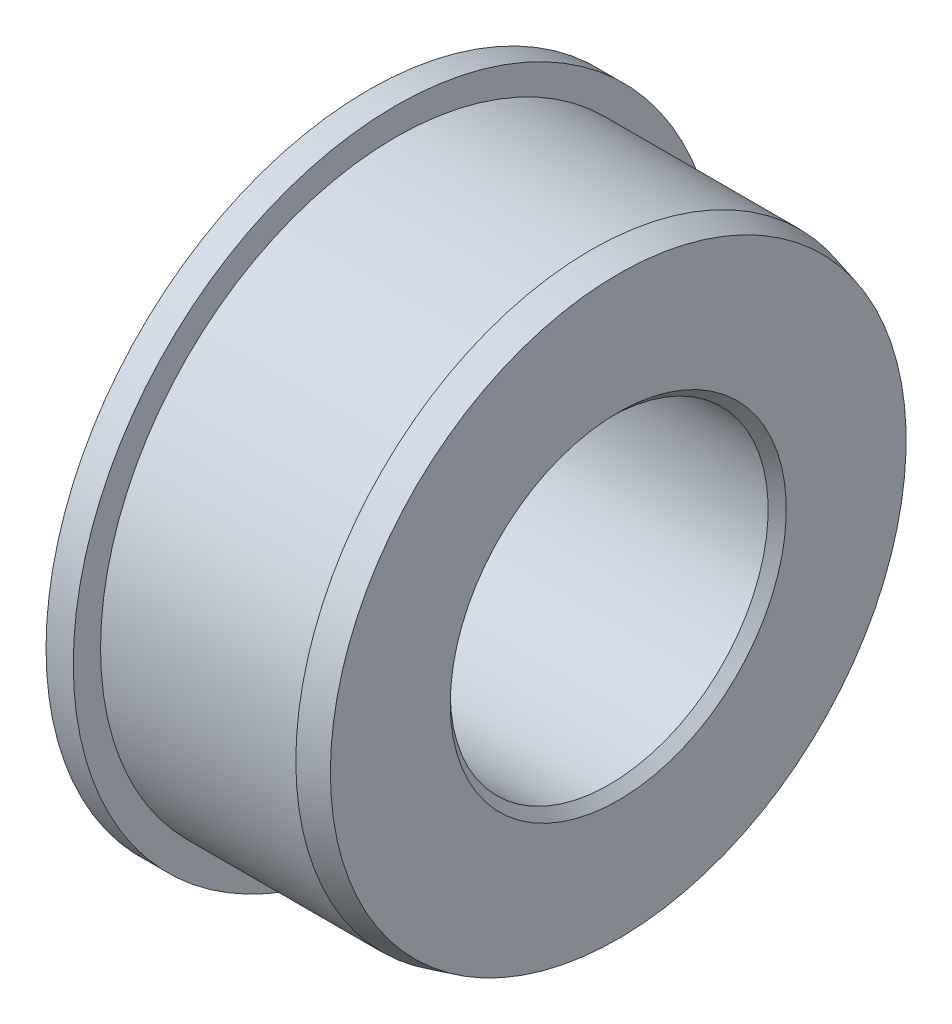
ISO-10303-21;
HEADER;
FILE_DESCRIPTION(('STEP AP214'),'2;1');
FILE_NAME('part.step','',(''),(''),'','','');
FILE_SCHEMA(('AUTOMOTIVE_DESIGN { 1 0 10303 214 1 1 1 1 }'));
ENDSEC;
DATA;
#1=APPLICATION_CONTEXT('core data for automotive mechanical design processes');
#2=APPLICATION_PROTOCOL_DEFINITION('international standard','automotive_design',2000,#1);
#3=PRODUCT_CONTEXT('',#1,'mechanical');
#4=PRODUCT('Part','Part','',(#3));
#5=PRODUCT_RELATED_PRODUCT_CATEGORY('part','',(#4));
#6=PRODUCT_DEFINITION_FORMATION('','',#4);
#7=PRODUCT_DEFINITION_CONTEXT('part definition',#1,'design');
#8=PRODUCT_DEFINITION('design','',#6,#7);
#9=PRODUCT_DEFINITION_SHAPE('','',#8);
#10=(LENGTH_UNIT() NAMED_UNIT(*) SI_UNIT(.MILLI.,.METRE.));
#11=(NAMED_UNIT(*) PLANE_ANGLE_UNIT() SI_UNIT($,.RADIAN.));
#12=(NAMED_UNIT(*) SI_UNIT($,.STERADIAN.) SOLID_ANGLE_UNIT());
#13=UNCERTAINTY_MEASURE_WITH_UNIT(LENGTH_MEASURE(1.E-05),#10,'distance_accuracy_value','');
#14=(GEOMETRIC_REPRESENTATION_CONTEXT(3) GLOBAL_UNCERTAINTY_ASSIGNED_CONTEXT((#13)) GLOBAL_UNIT_ASSIGNED_CONTEXT((#10,
#11,#12)) REPRESENTATION_CONTEXT('',''));
#15=CARTESIAN_POINT('',(0.,0.,0.));
#16=DIRECTION('',(0.,0.,1.));
#17=DIRECTION('',(1.,0.,0.));
#18=AXIS2_PLACEMENT_3D('',#15,#16,#17);
#19=CARTESIAN_POINT('',(0.,0.,0.));
#20=DIRECTION('',(-1.,0.,0.));
#21=DIRECTION('',(0.,0.,1.));
#22=AXIS2_PLACEMENT_3D('',#19,#20,#21);
#23=CYLINDRICAL_SURFACE('',#22,35.5);
#24=CARTESIAN_POINT('',(0.,0.,0.));
#25=DIRECTION('',(-1.,0.,0.));
#26=DIRECTION('',(0.,0.,1.));
#27=AXIS2_PLACEMENT_3D('',#24,#25,#26);
#28=CIRCLE('',#27,35.5);
#29=CARTESIAN_POINT('',(0.,0.,35.5));
#30=VERTEX_POINT('',#29);
#31=EDGE_CURVE('E66',#30,#30,#28,.T.);
#32=ORIENTED_EDGE('',*,*,#31,.F.);
#33=EDGE_LOOP('',(#32));
#34=FACE_BOUND('',#33,.T.);
#35=CARTESIAN_POINT('',(3.,0.,0.));
#36=DIRECTION('',(-1.,0.,0.));
#37=DIRECTION('',(0.,0.,1.));
#38=AXIS2_PLACEMENT_3D('',#35,#36,#37);
#39=CIRCLE('',#38,35.5);
#40=CARTESIAN_POINT('',(3.,0.,35.5));
#41=VERTEX_POINT('',#40);
#42=EDGE_CURVE('E10',#41,#41,#39,.T.);
#43=ORIENTED_EDGE('',*,*,#42,.T.);
#44=EDGE_LOOP('',(#43));
#45=FACE_BOUND('',#44,.T.);
#46=ADVANCED_FACE('F35',(#34,#45),#23,.T.);
#47=CARTESIAN_POINT('',(3.,35.5,0.));
#48=DIRECTION('',(-1.,0.,0.));
#49=DIRECTION('',(0.,0.,1.));
#50=AXIS2_PLACEMENT_3D('',#47,#48,#49);
#51=PLANE('',#50);
#52=ORIENTED_EDGE('',*,*,#42,.F.);
#53=EDGE_LOOP('',(#52));
#54=FACE_BOUND('',#53,.T.);
#55=CARTESIAN_POINT('',(3.,0.,0.));
#56=DIRECTION('',(-1.,0.,0.));
#57=DIRECTION('',(0.,0.,1.));
#58=AXIS2_PLACEMENT_3D('',#55,#56,#57);
#59=CIRCLE('',#58,32.5);
#60=CARTESIAN_POINT('',(3.,0.,32.5));
#61=VERTEX_POINT('',#60);
#62=EDGE_CURVE('E41',#61,#61,#59,.T.);
#63=ORIENTED_EDGE('',*,*,#62,.T.);
#64=EDGE_LOOP('',(#63));
#65=FACE_BOUND('',#64,.T.);
#66=ADVANCED_FACE('F73',(#54,#65),#51,.F.);
#67=CARTESIAN_POINT('',(0.,0.,0.));
#68=DIRECTION('',(-1.,0.,0.));
#69=DIRECTION('',(0.,0.,1.));
#70=AXIS2_PLACEMENT_3D('',#67,#68,#69);
#71=CYLINDRICAL_SURFACE('',#70,32.5);
#72=ORIENTED_EDGE('',*,*,#62,.F.);
#73=EDGE_LOOP('',(#72));
#74=FACE_BOUND('',#73,.T.);
#75=CARTESIAN_POINT('',(24.5,0.,0.));
#76=DIRECTION('',(-1.,0.,0.));
#77=DIRECTION('',(0.,0.,1.));
#78=AXIS2_PLACEMENT_3D('',#75,#76,#77);
#79=CIRCLE('',#78,32.5);
#80=CARTESIAN_POINT('',(24.5,0.,32.5));
#81=VERTEX_POINT('',#80);
#82=EDGE_CURVE('E45',#81,#81,#79,.T.);
#83=ORIENTED_EDGE('',*,*,#82,.T.);
#84=EDGE_LOOP('',(#83));
#85=FACE_BOUND('',#84,.T.);
#86=ADVANCED_FACE('F77',(#74,#85),#71,.T.);
#87=CARTESIAN_POINT('',(27.5,0.,0.));
#88=DIRECTION('',(-1.,0.,0.));
#89=DIRECTION('',(0.,0.,1.));
#90=AXIS2_PLACEMENT_3D('',#87,#88,#89);
#91=CONICAL_SURFACE('',#90,31.6961524227066,0.26179938779915);
#92=ORIENTED_EDGE('',*,*,#82,.F.);
#93=EDGE_LOOP('',(#92));
#94=FACE_BOUND('',#93,.T.);
#95=CARTESIAN_POINT('',(27.5,0.,0.));
#96=DIRECTION('',(-1.,0.,0.));
#97=DIRECTION('',(0.,0.,1.));
#98=AXIS2_PLACEMENT_3D('',#95,#96,#97);
#99=CIRCLE('',#98,31.6961524227066);
#100=CARTESIAN_POINT('',(27.5,0.,31.6961524227066));
#101=VERTEX_POINT('',#100);
#102=EDGE_CURVE('E49',#101,#101,#99,.T.);
#103=ORIENTED_EDGE('',*,*,#102,.T.);
#104=EDGE_LOOP('',(#103));
#105=FACE_BOUND('',#104,.T.);
#106=ADVANCED_FACE('F82',(#94,#105),#91,.T.);
#107=CARTESIAN_POINT('',(27.5,31.6961524227066,0.));
#108=DIRECTION('',(-1.,0.,0.));
#109=DIRECTION('',(0.,0.,1.));
#110=AXIS2_PLACEMENT_3D('',#107,#108,#109);
#111=PLANE('',#110);
#112=ORIENTED_EDGE('',*,*,#102,.F.);
#113=EDGE_LOOP('',(#112));
#114=FACE_BOUND('',#113,.T.);
#115=CARTESIAN_POINT('',(27.5,0.,0.));
#116=DIRECTION('',(-1.,0.,0.));
#117=DIRECTION('',(0.,0.,1.));
#118=AXIS2_PLACEMENT_3D('',#115,#116,#117);
#119=CIRCLE('',#118,18.5);
#120=CARTESIAN_POINT('',(27.5,0.,18.5));
#121=VERTEX_POINT('',#120);
#122=EDGE_CURVE('E54',#121,#121,#119,.T.);
#123=ORIENTED_EDGE('',*,*,#122,.T.);
#124=EDGE_LOOP('',(#123));
#125=FACE_BOUND('',#124,.T.);
#126=ADVANCED_FACE('F88',(#114,#125),#111,.F.);
#127=CARTESIAN_POINT('',(26.5,0.,0.));
#128=DIRECTION('',(1.,0.,0.));
#129=DIRECTION('',(0.,0.,-1.));
#130=AXIS2_PLACEMENT_3D('',#127,#128,#129);
#131=CONICAL_SURFACE('',#130,17.5,0.785398163397447);
#132=ORIENTED_EDGE('',*,*,#122,.F.);
#133=EDGE_LOOP('',(#132));
#134=FACE_BOUND('',#133,.T.);
#135=CARTESIAN_POINT('',(26.5,0.,0.));
#136=DIRECTION('',(-1.,0.,0.));
#137=DIRECTION('',(0.,0.,1.));
#138=AXIS2_PLACEMENT_3D('',#135,#136,#137);
#139=CIRCLE('',#138,17.5);
#140=CARTESIAN_POINT('',(26.5,0.,17.5));
#141=VERTEX_POINT('',#140);
#142=EDGE_CURVE('E57',#141,#141,#139,.T.);
#143=ORIENTED_EDGE('',*,*,#142,.T.);
#144=EDGE_LOOP('',(#143));
#145=FACE_BOUND('',#144,.T.);
#146=ADVANCED_FACE('F92',(#134,#145),#131,.F.);
#147=CARTESIAN_POINT('',(0.,0.,0.));
#148=DIRECTION('',(-1.,0.,0.));
#149=DIRECTION('',(0.,0.,1.));
#150=AXIS2_PLACEMENT_3D('',#147,#148,#149);
#151=CYLINDRICAL_SURFACE('',#150,17.5);
#152=ORIENTED_EDGE('',*,*,#142,.F.);
#153=EDGE_LOOP('',(#152));
#154=FACE_BOUND('',#153,.T.);
#155=CARTESIAN_POINT('',(1.,0.,0.));
#156=DIRECTION('',(-1.,0.,0.));
#157=DIRECTION('',(0.,0.,1.));
#158=AXIS2_PLACEMENT_3D('',#155,#156,#157);
#159=CIRCLE('',#158,17.5);
#160=CARTESIAN_POINT('',(1.,0.,17.5));
#161=VERTEX_POINT('',#160);
#162=EDGE_CURVE('E60',#161,#161,#159,.T.);
#163=ORIENTED_EDGE('',*,*,#162,.T.);
#164=EDGE_LOOP('',(#163));
#165=FACE_BOUND('',#164,.T.);
#166=ADVANCED_FACE('F96',(#154,#165),#151,.F.);
#167=CARTESIAN_POINT('',(0.,0.,0.));
#168=DIRECTION('',(-1.,0.,0.));
#169=DIRECTION('',(0.,0.,1.));
#170=AXIS2_PLACEMENT_3D('',#167,#168,#169);
#171=CONICAL_SURFACE('',#170,18.5,0.785398163397447);
#172=ORIENTED_EDGE('',*,*,#162,.F.);
#173=EDGE_LOOP('',(#172));
#174=FACE_BOUND('',#173,.T.);
#175=CARTESIAN_POINT('',(0.,0.,0.));
#176=DIRECTION('',(-1.,0.,0.));
#177=DIRECTION('',(0.,0.,1.));
#178=AXIS2_PLACEMENT_3D('',#175,#176,#177);
#179=CIRCLE('',#178,18.5);
#180=CARTESIAN_POINT('',(0.,0.,18.5));
#181=VERTEX_POINT('',#180);
#182=EDGE_CURVE('E63',#181,#181,#179,.T.);
#183=ORIENTED_EDGE('',*,*,#182,.T.);
#184=EDGE_LOOP('',(#183));
#185=FACE_BOUND('',#184,.T.);
#186=ADVANCED_FACE('F100',(#174,#185),#171,.F.);
#187=CARTESIAN_POINT('',(0.,18.5,0.));
#188=DIRECTION('',(1.,0.,0.));
#189=DIRECTION('',(0.,0.,-1.));
#190=AXIS2_PLACEMENT_3D('',#187,#188,#189);
#191=PLANE('',#190);
#192=ORIENTED_EDGE('',*,*,#182,.F.);
#193=EDGE_LOOP('',(#192));
#194=FACE_BOUND('',#193,.T.);
#195=ORIENTED_EDGE('',*,*,#31,.T.);
#196=EDGE_LOOP('',(#195));
#197=FACE_BOUND('',#196,.T.);
#198=ADVANCED_FACE('F70',(#194,#197),#191,.F.);
#199=CLOSED_SHELL('',(#46,#66,#86,#106,#126,#146,#166,#186,#198));
#200=MANIFOLD_SOLID_BREP('B2',#199);
#201=ADVANCED_BREP_SHAPE_REPRESENTATION('',(#18,#200),#14);
#202=SHAPE_DEFINITION_REPRESENTATION(#9,#201);
ENDSEC;
END-ISO-10303-21;
